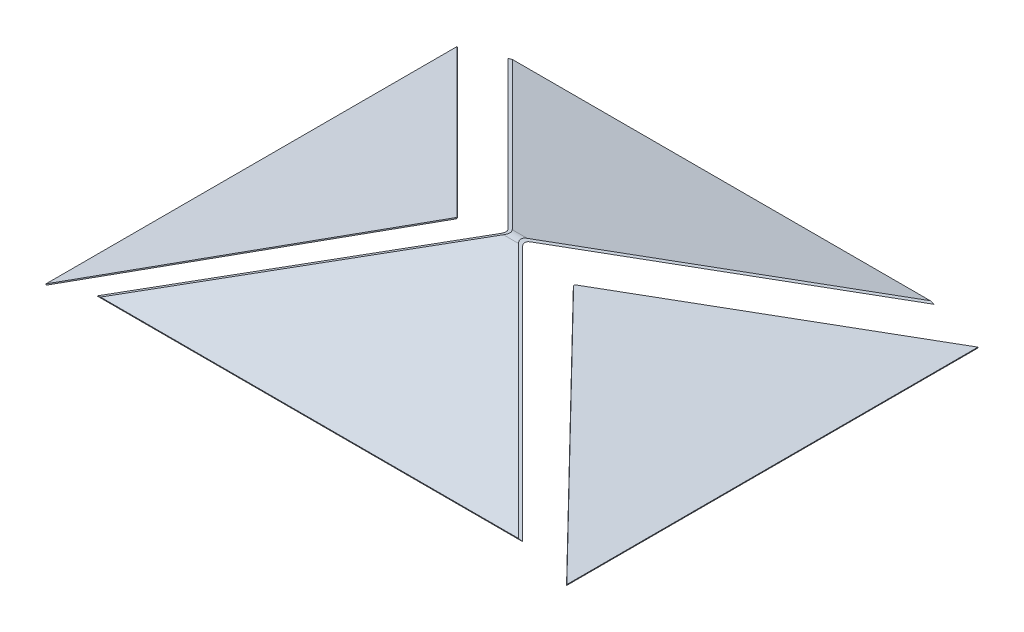
ISO-10303-21;
HEADER;
FILE_DESCRIPTION(('STEP AP214'),'2;1');
FILE_NAME('part.step','',(''),(''),'','','');
FILE_SCHEMA(('AUTOMOTIVE_DESIGN { 1 0 10303 214 1 1 1 1 }'));
ENDSEC;
DATA;
#1=APPLICATION_CONTEXT('core data for automotive mechanical design processes');
#2=APPLICATION_PROTOCOL_DEFINITION('international standard','automotive_design',2000,#1);
#3=PRODUCT_CONTEXT('',#1,'mechanical');
#4=PRODUCT('Part','Part','',(#3));
#5=PRODUCT_RELATED_PRODUCT_CATEGORY('part','',(#4));
#6=PRODUCT_DEFINITION_FORMATION('','',#4);
#7=PRODUCT_DEFINITION_CONTEXT('part definition',#1,'design');
#8=PRODUCT_DEFINITION('design','',#6,#7);
#9=PRODUCT_DEFINITION_SHAPE('','',#8);
#10=(LENGTH_UNIT() NAMED_UNIT(*) SI_UNIT(.MILLI.,.METRE.));
#11=(NAMED_UNIT(*) PLANE_ANGLE_UNIT() SI_UNIT($,.RADIAN.));
#12=(NAMED_UNIT(*) SI_UNIT($,.STERADIAN.) SOLID_ANGLE_UNIT());
#13=UNCERTAINTY_MEASURE_WITH_UNIT(LENGTH_MEASURE(1.E-05),#10,'distance_accuracy_value','');
#14=(GEOMETRIC_REPRESENTATION_CONTEXT(3) GLOBAL_UNCERTAINTY_ASSIGNED_CONTEXT((#13)) GLOBAL_UNIT_ASSIGNED_CONTEXT((#10,
#11,#12)) REPRESENTATION_CONTEXT('',''));
#15=CARTESIAN_POINT('',(0.,0.,0.));
#16=DIRECTION('',(0.,0.,1.));
#17=DIRECTION('',(1.,0.,0.));
#18=AXIS2_PLACEMENT_3D('',#15,#16,#17);
#19=CARTESIAN_POINT('',(134.970796635367,-14.5632168798622,0.));
#20=DIRECTION('',(-0.258819045102521,0.965925826289068,0.));
#21=DIRECTION('',(0.,0.,1.));
#22=AXIS2_PLACEMENT_3D('',#19,#20,#21);
#23=ELLIPSE('',#22,10.,9.99999999999998);
#24=DIRECTION('',(0.258819045102521,-0.965925826289068,0.));
#25=VECTOR('',#24,1.);
#26=SURFACE_OF_LINEAR_EXTRUSION('',#23,#25);
#27=CARTESIAN_POINT('',(135.229615680469,-15.5291427061513,0.));
#28=DIRECTION('',(-0.258819045102521,0.965925826289068,0.));
#29=DIRECTION('',(0.,0.,1.));
#30=AXIS2_PLACEMENT_3D('',#27,#28,#29);
#31=ELLIPSE('',#30,10.,9.99999999999998);
#32=CARTESIAN_POINT('',(144.865729430412,-12.9471538086797,0.691841839943579));
#33=VERTEX_POINT('',#32);
#34=CARTESIAN_POINT('',(144.865729430412,-12.9471538086797,-0.691841839943693));
#35=VERTEX_POINT('',#34);
#36=EDGE_CURVE('E109',#33,#35,#31,.T.);
#37=ORIENTED_EDGE('',*,*,#36,.T.);
#38=DIRECTION('',(0.258819045102521,-0.965925826289068,0.));
#39=VECTOR('',#38,1.);
#40=CARTESIAN_POINT('',(144.60691038531,-11.9812279823906,-0.691841839943693));
#41=LINE('',#40,#39);
#42=CARTESIAN_POINT('',(144.60691038531,-11.9812279823906,-0.691841839943693));
#43=VERTEX_POINT('',#42);
#44=EDGE_CURVE('E12',#43,#35,#41,.T.);
#45=ORIENTED_EDGE('',*,*,#44,.F.);
#46=CARTESIAN_POINT('',(144.60691038531,-11.9812279823906,0.691841839943579));
#47=VERTEX_POINT('',#46);
#48=EDGE_CURVE('E98',#47,#43,#23,.T.);
#49=ORIENTED_EDGE('',*,*,#48,.F.);
#50=DIRECTION('',(0.258819045102521,-0.965925826289068,0.));
#51=VECTOR('',#50,1.);
#52=CARTESIAN_POINT('',(144.60691038531,-11.9812279823906,0.691841839943579));
#53=LINE('',#52,#51);
#54=EDGE_CURVE('E106',#47,#33,#53,.T.);
#55=ORIENTED_EDGE('',*,*,#54,.T.);
#56=EDGE_LOOP('',(#37,#45,#49,#55));
#57=FACE_BOUND('',#56,.T.);
#58=ADVANCED_FACE('F46',(#57),#26,.F.);
#59=CARTESIAN_POINT('',(144.60691038531,-11.9812279823906,-0.691841839943693));
#60=DIRECTION('',(-0.671073674593449,-0.179813649169101,0.719254596676404));
#61=DIRECTION('',(0.731172197475327,0.,0.682192947514925));
#62=AXIS2_PLACEMENT_3D('',#59,#60,#61);
#63=PLANE('',#62);
#64=DIRECTION('',(-0.694746590606866,-0.186156787897386,-0.694746590606865));
#65=VECTOR('',#64,1.);
#66=CARTESIAN_POINT('',(144.865729430412,-12.9471538086797,-0.691841839943693));
#67=LINE('',#66,#65);
#68=CARTESIAN_POINT('',(-44.4371501508638,-63.6707075173686,-189.994721421219));
#69=VERTEX_POINT('',#68);
#70=EDGE_CURVE('E102',#35,#69,#67,.T.);
#71=ORIENTED_EDGE('',*,*,#70,.T.);
#72=DIRECTION('',(0.258819045102521,-0.965925826289068,0.));
#73=VECTOR('',#72,1.);
#74=CARTESIAN_POINT('',(-44.6959691959663,-62.7047816910796,-189.994721421219));
#75=LINE('',#74,#73);
#76=CARTESIAN_POINT('',(-44.6959691959663,-62.7047816910796,-189.994721421219));
#77=VERTEX_POINT('',#76);
#78=EDGE_CURVE('E55',#77,#69,#75,.T.);
#79=ORIENTED_EDGE('',*,*,#78,.F.);
#80=DIRECTION('',(-0.694746590606866,-0.186156787897386,-0.694746590606865));
#81=VECTOR('',#80,1.);
#82=CARTESIAN_POINT('',(144.60691038531,-11.9812279823906,-0.691841839943693));
#83=LINE('',#82,#81);
#84=EDGE_CURVE('E93',#43,#77,#83,.T.);
#85=ORIENTED_EDGE('',*,*,#84,.F.);
#86=ORIENTED_EDGE('',*,*,#44,.T.);
#87=EDGE_LOOP('',(#71,#79,#85,#86));
#88=FACE_BOUND('',#87,.T.);
#89=ADVANCED_FACE('F101',(#88),#63,.F.);
#90=CARTESIAN_POINT('',(-44.6959691959663,-62.7047816910796,-189.994721421219));
#91=DIRECTION('',(0.965925826289068,0.258819045102521,0.));
#92=DIRECTION('',(-0.258819045102521,0.965925826289068,0.));
#93=AXIS2_PLACEMENT_3D('',#90,#91,#92);
#94=PLANE('',#93);
#95=DIRECTION('',(0.,0.,1.));
#96=VECTOR('',#95,1.);
#97=CARTESIAN_POINT('',(-44.4371501508638,-63.6707075173686,-189.994721421219));
#98=LINE('',#97,#96);
#99=CARTESIAN_POINT('',(-44.4371501508638,-63.6707075173686,196.375609094408));
#100=VERTEX_POINT('',#99);
#101=EDGE_CURVE('E80',#69,#100,#98,.T.);
#102=ORIENTED_EDGE('',*,*,#101,.T.);
#103=DIRECTION('',(0.258819045102521,-0.965925826289068,0.));
#104=VECTOR('',#103,1.);
#105=CARTESIAN_POINT('',(-44.6959691959663,-62.7047816910796,196.375609094408));
#106=LINE('',#105,#104);
#107=CARTESIAN_POINT('',(-44.6959691959663,-62.7047816910796,196.375609094408));
#108=VERTEX_POINT('',#107);
#109=EDGE_CURVE('E103',#108,#100,#106,.T.);
#110=ORIENTED_EDGE('',*,*,#109,.F.);
#111=DIRECTION('',(0.,0.,1.));
#112=VECTOR('',#111,1.);
#113=CARTESIAN_POINT('',(-44.6959691959663,-62.7047816910796,-189.994721421219));
#114=LINE('',#113,#112);
#115=EDGE_CURVE('E96',#77,#108,#114,.T.);
#116=ORIENTED_EDGE('',*,*,#115,.F.);
#117=ORIENTED_EDGE('',*,*,#78,.T.);
#118=EDGE_LOOP('',(#102,#110,#116,#117));
#119=FACE_BOUND('',#118,.T.);
#120=ADVANCED_FACE('F104',(#119),#94,.F.);
#121=CARTESIAN_POINT('',(-44.6959691959663,-62.7047816910796,196.375609094408));
#122=DIRECTION('',(-0.68249458473455,-0.182873872818237,-0.707642768950884));
#123=DIRECTION('',(-0.71978087835063,0.,0.694201330422808));
#124=AXIS2_PLACEMENT_3D('',#121,#122,#123);
#125=PLANE('',#124);
#126=DIRECTION('',(0.683530426316366,0.183151425733571,-0.706570386834551));
#127=VECTOR('',#126,1.);
#128=CARTESIAN_POINT('',(-44.4371501508638,-63.6707075173686,196.375609094408));
#129=LINE('',#128,#127);
#130=EDGE_CURVE('E86',#100,#33,#129,.T.);
#131=ORIENTED_EDGE('',*,*,#130,.T.);
#132=ORIENTED_EDGE('',*,*,#54,.F.);
#133=DIRECTION('',(0.683530426316366,0.183151425733571,-0.706570386834551));
#134=VECTOR('',#133,1.);
#135=CARTESIAN_POINT('',(-44.6959691959663,-62.7047816910796,196.375609094408));
#136=LINE('',#135,#134);
#137=EDGE_CURVE('E63',#108,#47,#136,.T.);
#138=ORIENTED_EDGE('',*,*,#137,.F.);
#139=ORIENTED_EDGE('',*,*,#109,.T.);
#140=EDGE_LOOP('',(#131,#132,#138,#139));
#141=FACE_BOUND('',#140,.T.);
#142=ADVANCED_FACE('F116',(#141),#125,.F.);
#143=CARTESIAN_POINT('',(134.970796635367,-14.5632168798622,0.));
#144=DIRECTION('',(-0.258819045102521,0.965925826289068,0.));
#145=DIRECTION('',(-0.965925826289068,-0.258819045102521,0.));
#146=AXIS2_PLACEMENT_3D('',#143,#144,#145);
#147=PLANE('',#146);
#148=ORIENTED_EDGE('',*,*,#48,.T.);
#149=ORIENTED_EDGE('',*,*,#84,.T.);
#150=ORIENTED_EDGE('',*,*,#115,.T.);
#151=ORIENTED_EDGE('',*,*,#137,.T.);
#152=EDGE_LOOP('',(#148,#149,#150,#151));
#153=FACE_BOUND('',#152,.T.);
#154=ADVANCED_FACE('F94',(#153),#147,.T.);
#155=CARTESIAN_POINT('',(135.229615680469,-15.5291427061513,0.));
#156=DIRECTION('',(-0.258819045102521,0.965925826289068,0.));
#157=DIRECTION('',(-0.965925826289068,-0.258819045102521,0.));
#158=AXIS2_PLACEMENT_3D('',#155,#156,#157);
#159=PLANE('',#158);
#160=ORIENTED_EDGE('',*,*,#36,.F.);
#161=ORIENTED_EDGE('',*,*,#130,.F.);
#162=ORIENTED_EDGE('',*,*,#101,.F.);
#163=ORIENTED_EDGE('',*,*,#70,.F.);
#164=EDGE_LOOP('',(#160,#161,#162,#163));
#165=FACE_BOUND('',#164,.T.);
#166=ADVANCED_FACE('F119',(#165),#159,.F.);
#167=CLOSED_SHELL('',(#58,#89,#120,#142,#154,#166));
#168=MANIFOLD_SOLID_BREP('B2',#167);
#169=CARTESIAN_POINT('',(255.39308961469,-11.9812279823906,0.691841839943619));
#170=DIRECTION('',(0.68249458473455,-0.182873872818237,-0.707642768950883));
#171=DIRECTION('',(-0.719780878350629,0.,-0.694201330422808));
#172=AXIS2_PLACEMENT_3D('',#169,#170,#171);
#173=PLANE('',#172);
#174=DIRECTION('',(0.683530426316366,-0.183151425733571,0.706570386834551));
#175=VECTOR('',#174,1.);
#176=CARTESIAN_POINT('',(255.134270569588,-12.9471538086797,0.691841839943619));
#177=LINE('',#176,#175);
#178=CARTESIAN_POINT('',(255.134270569588,-12.9471538086797,0.691841839943615));
#179=VERTEX_POINT('',#178);
#180=CARTESIAN_POINT('',(444.437150150864,-63.6707075173686,196.375609094408));
#181=VERTEX_POINT('',#180);
#182=EDGE_CURVE('E244',#179,#181,#177,.T.);
#183=ORIENTED_EDGE('',*,*,#182,.T.);
#184=DIRECTION('',(-0.258819045102521,-0.965925826289068,0.));
#185=VECTOR('',#184,1.);
#186=CARTESIAN_POINT('',(444.695969195966,-62.7047816910795,196.375609094408));
#187=LINE('',#186,#185);
#188=CARTESIAN_POINT('',(444.695969195966,-62.7047816910795,196.375609094408));
#189=VERTEX_POINT('',#188);
#190=EDGE_CURVE('E44',#189,#181,#187,.T.);
#191=ORIENTED_EDGE('',*,*,#190,.F.);
#192=DIRECTION('',(0.683530426316366,-0.183151425733571,0.706570386834551));
#193=VECTOR('',#192,1.);
#194=CARTESIAN_POINT('',(255.39308961469,-11.9812279823906,0.691841839943619));
#195=LINE('',#194,#193);
#196=CARTESIAN_POINT('',(255.39308961469,-11.9812279823906,0.691841839943615));
#197=VERTEX_POINT('',#196);
#198=EDGE_CURVE('E231',#197,#189,#195,.T.);
#199=ORIENTED_EDGE('',*,*,#198,.F.);
#200=DIRECTION('',(-0.258819045102521,-0.965925826289068,0.));
#201=VECTOR('',#200,1.);
#202=CARTESIAN_POINT('',(255.39308961469,-11.9812279823906,0.691841839943615));
#203=LINE('',#202,#201);
#204=EDGE_CURVE('E239',#197,#179,#203,.T.);
#205=ORIENTED_EDGE('',*,*,#204,.T.);
#206=EDGE_LOOP('',(#183,#191,#199,#205));
#207=FACE_BOUND('',#206,.T.);
#208=ADVANCED_FACE('F180',(#207),#173,.F.);
#209=CARTESIAN_POINT('',(444.695969195966,-62.7047816910795,196.375609094408));
#210=DIRECTION('',(-0.965925826289068,0.258819045102521,0.));
#211=DIRECTION('',(-0.258819045102521,-0.965925826289068,0.));
#212=AXIS2_PLACEMENT_3D('',#209,#210,#211);
#213=PLANE('',#212);
#214=DIRECTION('',(0.,0.,-1.));
#215=VECTOR('',#214,1.);
#216=CARTESIAN_POINT('',(444.437150150864,-63.6707075173686,196.375609094408));
#217=LINE('',#216,#215);
#218=CARTESIAN_POINT('',(444.437150150864,-63.6707075173686,-189.994721421219));
#219=VERTEX_POINT('',#218);
#220=EDGE_CURVE('E235',#181,#219,#217,.T.);
#221=ORIENTED_EDGE('',*,*,#220,.T.);
#222=DIRECTION('',(-0.258819045102521,-0.965925826289068,0.));
#223=VECTOR('',#222,1.);
#224=CARTESIAN_POINT('',(444.695969195966,-62.7047816910795,-189.994721421219));
#225=LINE('',#224,#223);
#226=CARTESIAN_POINT('',(444.695969195966,-62.7047816910795,-189.994721421219));
#227=VERTEX_POINT('',#226);
#228=EDGE_CURVE('E188',#227,#219,#225,.T.);
#229=ORIENTED_EDGE('',*,*,#228,.F.);
#230=DIRECTION('',(0.,0.,-1.));
#231=VECTOR('',#230,1.);
#232=CARTESIAN_POINT('',(444.695969195966,-62.7047816910795,196.375609094408));
#233=LINE('',#232,#231);
#234=EDGE_CURVE('E226',#189,#227,#233,.T.);
#235=ORIENTED_EDGE('',*,*,#234,.F.);
#236=ORIENTED_EDGE('',*,*,#190,.T.);
#237=EDGE_LOOP('',(#221,#229,#235,#236));
#238=FACE_BOUND('',#237,.T.);
#239=ADVANCED_FACE('F234',(#238),#213,.F.);
#240=CARTESIAN_POINT('',(444.695969195966,-62.7047816910795,-189.994721421219));
#241=DIRECTION('',(0.671073674593449,-0.179813649169101,0.719254596676404));
#242=DIRECTION('',(0.731172197475327,0.,-0.682192947514925));
#243=AXIS2_PLACEMENT_3D('',#240,#241,#242);
#244=PLANE('',#243);
#245=DIRECTION('',(-0.694746590606866,0.186156787897385,0.694746590606865));
#246=VECTOR('',#245,1.);
#247=CARTESIAN_POINT('',(444.437150150864,-63.6707075173686,-189.994721421219));
#248=LINE('',#247,#246);
#249=CARTESIAN_POINT('',(255.134270569588,-12.9471538086797,-0.691841839943661));
#250=VERTEX_POINT('',#249);
#251=EDGE_CURVE('E213',#219,#250,#248,.T.);
#252=ORIENTED_EDGE('',*,*,#251,.T.);
#253=DIRECTION('',(-0.258819045102521,-0.965925826289068,0.));
#254=VECTOR('',#253,1.);
#255=CARTESIAN_POINT('',(255.39308961469,-11.9812279823906,-0.691841839943661));
#256=LINE('',#255,#254);
#257=CARTESIAN_POINT('',(255.39308961469,-11.9812279823906,-0.691841839943661));
#258=VERTEX_POINT('',#257);
#259=EDGE_CURVE('E236',#258,#250,#256,.T.);
#260=ORIENTED_EDGE('',*,*,#259,.F.);
#261=DIRECTION('',(-0.694746590606866,0.186156787897385,0.694746590606865));
#262=VECTOR('',#261,1.);
#263=CARTESIAN_POINT('',(444.695969195966,-62.7047816910795,-189.994721421219));
#264=LINE('',#263,#262);
#265=EDGE_CURVE('E229',#227,#258,#264,.T.);
#266=ORIENTED_EDGE('',*,*,#265,.F.);
#267=ORIENTED_EDGE('',*,*,#228,.T.);
#268=EDGE_LOOP('',(#252,#260,#266,#267));
#269=FACE_BOUND('',#268,.T.);
#270=ADVANCED_FACE('F237',(#269),#244,.F.);
#271=CARTESIAN_POINT('',(265.029203364633,-14.5632168798622,0.));
#272=DIRECTION('',(0.258819045102521,0.965925826289068,0.));
#273=DIRECTION('',(0.965925826289068,-0.258819045102521,0.));
#274=AXIS2_PLACEMENT_3D('',#271,#272,#273);
#275=ELLIPSE('',#274,10.,10.);
#276=DIRECTION('',(-0.258819045102521,-0.965925826289068,0.));
#277=VECTOR('',#276,1.);
#278=SURFACE_OF_LINEAR_EXTRUSION('',#275,#277);
#279=CARTESIAN_POINT('',(264.770384319531,-15.5291427061513,0.));
#280=DIRECTION('',(0.258819045102521,0.965925826289068,0.));
#281=DIRECTION('',(0.965925826289068,-0.258819045102521,0.));
#282=AXIS2_PLACEMENT_3D('',#279,#280,#281);
#283=ELLIPSE('',#282,10.,10.);
#284=EDGE_CURVE('E219',#250,#179,#283,.T.);
#285=ORIENTED_EDGE('',*,*,#284,.T.);
#286=ORIENTED_EDGE('',*,*,#204,.F.);
#287=EDGE_CURVE('E196',#258,#197,#275,.T.);
#288=ORIENTED_EDGE('',*,*,#287,.F.);
#289=ORIENTED_EDGE('',*,*,#259,.T.);
#290=EDGE_LOOP('',(#285,#286,#288,#289));
#291=FACE_BOUND('',#290,.T.);
#292=ADVANCED_FACE('F247',(#291),#278,.F.);
#293=CARTESIAN_POINT('',(265.029203364633,-14.5632168798622,0.));
#294=DIRECTION('',(0.258819045102521,0.965925826289068,0.));
#295=DIRECTION('',(-0.965925826289068,0.258819045102521,0.));
#296=AXIS2_PLACEMENT_3D('',#293,#294,#295);
#297=PLANE('',#296);
#298=ORIENTED_EDGE('',*,*,#198,.T.);
#299=ORIENTED_EDGE('',*,*,#234,.T.);
#300=ORIENTED_EDGE('',*,*,#265,.T.);
#301=ORIENTED_EDGE('',*,*,#287,.T.);
#302=EDGE_LOOP('',(#298,#299,#300,#301));
#303=FACE_BOUND('',#302,.T.);
#304=ADVANCED_FACE('F227',(#303),#297,.T.);
#305=CARTESIAN_POINT('',(264.770384319531,-15.5291427061513,0.));
#306=DIRECTION('',(0.258819045102521,0.965925826289068,0.));
#307=DIRECTION('',(-0.965925826289068,0.258819045102521,0.));
#308=AXIS2_PLACEMENT_3D('',#305,#306,#307);
#309=PLANE('',#308);
#310=ORIENTED_EDGE('',*,*,#182,.F.);
#311=ORIENTED_EDGE('',*,*,#284,.F.);
#312=ORIENTED_EDGE('',*,*,#251,.F.);
#313=ORIENTED_EDGE('',*,*,#220,.F.);
#314=EDGE_LOOP('',(#310,#311,#312,#313));
#315=FACE_BOUND('',#314,.T.);
#316=ADVANCED_FACE('F251',(#315),#309,.F.);
#317=CLOSED_SHELL('',(#208,#239,#270,#292,#304,#316));
#318=MANIFOLD_SOLID_BREP('B6',#317);
#319=CARTESIAN_POINT('',(400.,-50.7978831942273,193.443984302913));
#320=DIRECTION('',(0.,0.258819045102555,-0.965925826289059));
#321=DIRECTION('',(0.,0.965925826289059,0.258819045102555));
#322=AXIS2_PLACEMENT_3D('',#319,#320,#321);
#323=PLANE('',#322);
#324=DIRECTION('',(-1.,0.,0.));
#325=VECTOR('',#324,1.);
#326=CARTESIAN_POINT('',(400.,-51.7638090205041,193.185165257814));
#327=LINE('',#326,#325);
#328=CARTESIAN_POINT('',(400.,-51.7638090205041,193.185165257813));
#329=VERTEX_POINT('',#328);
#330=CARTESIAN_POINT('',(0.,-51.7638090205041,193.185165257814));
#331=VERTEX_POINT('',#330);
#332=EDGE_CURVE('E178',#329,#331,#327,.T.);
#333=ORIENTED_EDGE('',*,*,#332,.F.);
#334=DIRECTION('',(-0.963611374994279,0.258198889747161,0.0691841839943741));
#335=VECTOR('',#334,1.);
#336=CARTESIAN_POINT('',(399.74241977966,-51.6947906084777,193.203658685579));
#337=LINE('',#336,#335);
#338=CARTESIAN_POINT('',(396.395115739993,-50.7978831942274,193.443984302913));
#339=VERTEX_POINT('',#338);
#340=EDGE_CURVE('E369',#329,#339,#337,.T.);
#341=ORIENTED_EDGE('',*,*,#340,.T.);
#342=DIRECTION('',(-1.,0.,0.));
#343=VECTOR('',#342,1.);
#344=CARTESIAN_POINT('',(400.,-50.7978831942273,193.443984302913));
#345=LINE('',#344,#343);
#346=CARTESIAN_POINT('',(3.60488426000938,-50.7978831942273,193.443984302913));
#347=VERTEX_POINT('',#346);
#348=EDGE_CURVE('E379',#339,#347,#345,.T.);
#349=ORIENTED_EDGE('',*,*,#348,.T.);
#350=DIRECTION('',(-0.96361137499428,-0.258198889747161,-0.0691841839943741));
#351=VECTOR('',#350,1.);
#352=CARTESIAN_POINT('',(371.676333027687,47.8265642600255,219.870325352249));
#353=LINE('',#352,#351);
#354=EDGE_CURVE('E327',#347,#331,#353,.T.);
#355=ORIENTED_EDGE('',*,*,#354,.T.);
#356=EDGE_LOOP('',(#333,#341,#349,#355));
#357=FACE_BOUND('',#356,.T.);
#358=ADVANCED_FACE('F305',(#357),#323,.F.);
#359=CARTESIAN_POINT('',(400.,-51.7638090205041,193.185165257814));
#360=DIRECTION('',(0.,0.965925826289068,0.258819045102521));
#361=DIRECTION('',(0.,-0.258819045102521,0.965925826289068));
#362=AXIS2_PLACEMENT_3D('',#359,#360,#361);
#363=PLANE('',#362);
#364=DIRECTION('',(-1.,0.,0.));
#365=VECTOR('',#364,1.);
#366=CARTESIAN_POINT('',(400.,-1.04025531181522,3.8822856765378));
#367=LINE('',#366,#365);
#368=CARTESIAN_POINT('',(210.697120418724,-1.04025531181522,3.8822856765378));
#369=VERTEX_POINT('',#368);
#370=CARTESIAN_POINT('',(189.302879581276,-1.04025531181522,3.8822856765378));
#371=VERTEX_POINT('',#370);
#372=EDGE_CURVE('E312',#369,#371,#367,.T.);
#373=ORIENTED_EDGE('',*,*,#372,.F.);
#374=DIRECTION('',(0.694746590606866,-0.186156787897385,0.694746590606866));
#375=VECTOR('',#374,1.);
#376=CARTESIAN_POINT('',(400.,-51.7638090205041,193.185165257814));
#377=LINE('',#376,#375);
#378=EDGE_CURVE('E380',#369,#329,#377,.T.);
#379=ORIENTED_EDGE('',*,*,#378,.T.);
#380=ORIENTED_EDGE('',*,*,#332,.T.);
#381=DIRECTION('',(0.694746590606866,0.186156787897385,-0.694746590606866));
#382=VECTOR('',#381,1.);
#383=CARTESIAN_POINT('',(193.069130063946,-0.0310915364905365,0.116035193868075));
#384=LINE('',#383,#382);
#385=EDGE_CURVE('E412',#331,#371,#384,.T.);
#386=ORIENTED_EDGE('',*,*,#385,.T.);
#387=EDGE_LOOP('',(#373,#379,#380,#386));
#388=FACE_BOUND('',#387,.T.);
#389=ADVANCED_FACE('F411',(#388),#363,.F.);
#390=CARTESIAN_POINT('',(400.,-15.5291427061513,0.));
#391=DIRECTION('',(-1.,0.,0.));
#392=DIRECTION('',(0.,0.,1.));
#393=AXIS2_PLACEMENT_3D('',#390,#391,#392);
#394=CYLINDRICAL_SURFACE('',#393,15.);
#395=DIRECTION('',(-1.,0.,0.));
#396=VECTOR('',#395,1.);
#397=CARTESIAN_POINT('',(400.,-1.04025531181523,-3.88228567653782));
#398=LINE('',#397,#396);
#399=CARTESIAN_POINT('',(210.697120418724,-1.04025531181523,-3.88228567653782));
#400=VERTEX_POINT('',#399);
#401=CARTESIAN_POINT('',(189.302879581276,-1.04025531181523,-3.88228567653784));
#402=VERTEX_POINT('',#401);
#403=EDGE_CURVE('E398',#400,#402,#398,.T.);
#404=ORIENTED_EDGE('',*,*,#403,.F.);
#405=CARTESIAN_POINT('',(264.770384319531,-15.5291427061513,0.));
#406=DIRECTION('',(-0.258819045102521,-0.965925826289068,0.));
#407=DIRECTION('',(-0.965925826289068,0.258819045102521,0.));
#408=AXIS2_PLACEMENT_3D('',#405,#406,#407);
#409=ELLIPSE('',#408,57.9555495773443,15.);
#410=EDGE_CURVE('E408',#400,#369,#409,.F.);
#411=ORIENTED_EDGE('',*,*,#410,.T.);
#412=ORIENTED_EDGE('',*,*,#372,.T.);
#413=CARTESIAN_POINT('',(135.229615680469,-15.5291427061513,0.));
#414=DIRECTION('',(0.258819045102521,-0.965925826289068,0.));
#415=DIRECTION('',(-0.965925826289068,-0.258819045102521,0.));
#416=AXIS2_PLACEMENT_3D('',#413,#414,#415);
#417=ELLIPSE('',#416,57.9555495773443,15.);
#418=EDGE_CURVE('E407',#371,#402,#417,.F.);
#419=ORIENTED_EDGE('',*,*,#418,.T.);
#420=EDGE_LOOP('',(#404,#411,#412,#419));
#421=FACE_BOUND('',#420,.T.);
#422=ADVANCED_FACE('F406',(#421),#394,.F.);
#423=CARTESIAN_POINT('',(400.,-1.04025531181523,-3.88228567653782));
#424=DIRECTION('',(0.,0.965925826289068,-0.258819045102521));
#425=DIRECTION('',(0.,0.258819045102521,0.965925826289068));
#426=AXIS2_PLACEMENT_3D('',#423,#424,#425);
#427=PLANE('',#426);
#428=DIRECTION('',(-1.,0.,0.));
#429=VECTOR('',#428,1.);
#430=CARTESIAN_POINT('',(400.,-51.7638090205041,-193.185165257814));
#431=LINE('',#430,#429);
#432=CARTESIAN_POINT('',(400.,-51.7638090205041,-193.185165257814));
#433=VERTEX_POINT('',#432);
#434=CARTESIAN_POINT('',(0.,-51.7638090205041,-193.185165257814));
#435=VERTEX_POINT('',#434);
#436=EDGE_CURVE('E395',#433,#435,#431,.T.);
#437=ORIENTED_EDGE('',*,*,#436,.F.);
#438=DIRECTION('',(-0.694746590606866,0.186156787897385,0.694746590606866));
#439=VECTOR('',#438,1.);
#440=CARTESIAN_POINT('',(302.068476117116,-25.5231362825362,-95.2536413749297));
#441=LINE('',#440,#439);
#442=EDGE_CURVE('E426',#433,#400,#441,.T.);
#443=ORIENTED_EDGE('',*,*,#442,.T.);
#444=ORIENTED_EDGE('',*,*,#403,.T.);
#445=DIRECTION('',(-0.694746590606866,-0.186156787897385,-0.694746590606866));
#446=VECTOR('',#445,1.);
#447=CARTESIAN_POINT('',(291.00065394683,26.2095812014774,97.8154886890158));
#448=LINE('',#447,#446);
#449=EDGE_CURVE('E415',#402,#435,#448,.T.);
#450=ORIENTED_EDGE('',*,*,#449,.T.);
#451=EDGE_LOOP('',(#437,#443,#444,#450));
#452=FACE_BOUND('',#451,.T.);
#453=ADVANCED_FACE('F431',(#452),#427,.F.);
#454=CARTESIAN_POINT('',(400.,-51.7638090205041,-193.185165257814));
#455=DIRECTION('',(0.,0.258819045102521,0.965925826289068));
#456=DIRECTION('',(0.,-0.965925826289068,0.258819045102521));
#457=AXIS2_PLACEMENT_3D('',#454,#455,#456);
#458=PLANE('',#457);
#459=DIRECTION('',(-1.,0.,0.));
#460=VECTOR('',#459,1.);
#461=CARTESIAN_POINT('',(400.,-50.7978831942028,-193.443984302919));
#462=LINE('',#461,#460);
#463=CARTESIAN_POINT('',(396.3951157399,-50.7978831942028,-193.443984302919));
#464=VERTEX_POINT('',#463);
#465=CARTESIAN_POINT('',(3.6048842600998,-50.7978831942028,-193.443984302919));
#466=VERTEX_POINT('',#465);
#467=EDGE_CURVE('E392',#464,#466,#462,.T.);
#468=ORIENTED_EDGE('',*,*,#467,.F.);
#469=DIRECTION('',(0.96361137499428,-0.258198889747161,0.0691841839943643));
#470=VECTOR('',#469,1.);
#471=CARTESIAN_POINT('',(400.,-51.7638090205041,-193.185165257814));
#472=LINE('',#471,#470);
#473=EDGE_CURVE('E423',#464,#433,#472,.T.);
#474=ORIENTED_EDGE('',*,*,#473,.T.);
#475=ORIENTED_EDGE('',*,*,#436,.T.);
#476=DIRECTION('',(0.96361137499428,0.258198889747161,-0.0691841839943643));
#477=VECTOR('',#476,1.);
#478=CARTESIAN_POINT('',(371.418752807347,47.7575458479992,-219.85183192448));
#479=LINE('',#478,#477);
#480=EDGE_CURVE('E437',#435,#466,#479,.T.);
#481=ORIENTED_EDGE('',*,*,#480,.T.);
#482=EDGE_LOOP('',(#468,#474,#475,#481));
#483=FACE_BOUND('',#482,.T.);
#484=ADVANCED_FACE('F435',(#483),#458,.F.);
#485=CARTESIAN_POINT('',(400.,-50.7978831942028,-193.443984302919));
#486=DIRECTION('',(0.,-0.965925826289089,0.258819045102443));
#487=DIRECTION('',(0.,-0.258819045102443,-0.965925826289089));
#488=AXIS2_PLACEMENT_3D('',#485,#486,#487);
#489=PLANE('',#488);
#490=DIRECTION('',(-1.,0.,0.));
#491=VECTOR('',#490,1.);
#492=CARTESIAN_POINT('',(400.,-0.0743294855297209,-4.14110472164212));
#493=LINE('',#492,#491);
#494=CARTESIAN_POINT('',(207.092236158684,-0.0743294855297203,-4.14110472164212));
#495=VERTEX_POINT('',#494);
#496=CARTESIAN_POINT('',(192.907763841316,-0.0743294855297203,-4.14110472164212));
#497=VERTEX_POINT('',#496);
#498=EDGE_CURVE('E386',#495,#497,#493,.T.);
#499=ORIENTED_EDGE('',*,*,#498,.F.);
#500=DIRECTION('',(0.694746590606758,-0.186156787897357,-0.694746590606981));
#501=VECTOR('',#500,1.);
#502=CARTESIAN_POINT('',(398.135095410097,-51.2641093416784,-195.183963973116));
#503=LINE('',#502,#501);
#504=EDGE_CURVE('E420',#495,#464,#503,.T.);
#505=ORIENTED_EDGE('',*,*,#504,.T.);
#506=ORIENTED_EDGE('',*,*,#467,.T.);
#507=DIRECTION('',(0.694746590606759,0.186156787897357,0.694746590606981));
#508=VECTOR('',#507,1.);
#509=CARTESIAN_POINT('',(194.934034653789,0.468608142319235,-2.11483390916825));
#510=LINE('',#509,#508);
#511=EDGE_CURVE('E442',#466,#497,#510,.T.);
#512=ORIENTED_EDGE('',*,*,#511,.T.);
#513=EDGE_LOOP('',(#499,#505,#506,#512));
#514=FACE_BOUND('',#513,.T.);
#515=ADVANCED_FACE('F441',(#514),#489,.F.);
#516=CARTESIAN_POINT('',(400.,-15.5291427061513,0.));
#517=DIRECTION('',(-1.,0.,0.));
#518=DIRECTION('',(0.,0.,1.));
#519=AXIS2_PLACEMENT_3D('',#516,#517,#518);
#520=CYLINDRICAL_SURFACE('',#519,15.9999999999971);
#521=DIRECTION('',(-1.,0.,0.));
#522=VECTOR('',#521,1.);
#523=CARTESIAN_POINT('',(400.,-0.0743294855272865,4.14110472163303));
#524=LINE('',#523,#522);
#525=CARTESIAN_POINT('',(207.092236158675,-0.0743294855272865,4.14110472163303));
#526=VERTEX_POINT('',#525);
#527=CARTESIAN_POINT('',(192.907763841325,-0.07432948552729,4.14110472163305));
#528=VERTEX_POINT('',#527);
#529=EDGE_CURVE('E384',#526,#528,#524,.T.);
#530=ORIENTED_EDGE('',*,*,#529,.F.);
#531=CARTESIAN_POINT('',(264.770384319531,-15.5291427061513,0.));
#532=DIRECTION('',(-0.258819045102521,-0.965925826289068,0.));
#533=DIRECTION('',(-0.965925826289068,0.258819045102521,0.));
#534=AXIS2_PLACEMENT_3D('',#531,#532,#533);
#535=ELLIPSE('',#534,61.819252882489,15.9999999999971);
#536=EDGE_CURVE('E319',#526,#495,#535,.T.);
#537=ORIENTED_EDGE('',*,*,#536,.T.);
#538=ORIENTED_EDGE('',*,*,#498,.T.);
#539=CARTESIAN_POINT('',(135.229615680469,-15.5291427061513,0.));
#540=DIRECTION('',(0.258819045102521,-0.965925826289068,0.));
#541=DIRECTION('',(-0.965925826289068,-0.258819045102521,0.));
#542=AXIS2_PLACEMENT_3D('',#539,#540,#541);
#543=ELLIPSE('',#542,61.819252882489,15.9999999999971);
#544=EDGE_CURVE('E446',#497,#528,#543,.T.);
#545=ORIENTED_EDGE('',*,*,#544,.T.);
#546=EDGE_LOOP('',(#530,#537,#538,#545));
#547=FACE_BOUND('',#546,.T.);
#548=ADVANCED_FACE('F444',(#547),#520,.T.);
#549=CARTESIAN_POINT('',(400.,-0.0743294855272856,4.14110472163303));
#550=DIRECTION('',(0.,-0.965925826289055,-0.258819045102568));
#551=DIRECTION('',(0.,0.258819045102568,-0.965925826289056));
#552=AXIS2_PLACEMENT_3D('',#549,#550,#551);
#553=PLANE('',#552);
#554=ORIENTED_EDGE('',*,*,#348,.F.);
#555=DIRECTION('',(-0.694746590606932,0.186156787897403,-0.694746590606795));
#556=VECTOR('',#555,1.);
#557=CARTESIAN_POINT('',(300.203571527257,-25.0234366037223,97.2524400901967));
#558=LINE('',#557,#556);
#559=EDGE_CURVE('E366',#339,#526,#558,.T.);
#560=ORIENTED_EDGE('',*,*,#559,.T.);
#561=ORIENTED_EDGE('',*,*,#529,.T.);
#562=DIRECTION('',(-0.694746590606932,-0.186156787897403,0.694746590606795));
#563=VECTOR('',#562,1.);
#564=CARTESIAN_POINT('',(292.865558536726,26.7092808803012,-95.8166899737475));
#565=LINE('',#564,#563);
#566=EDGE_CURVE('E383',#528,#347,#565,.T.);
#567=ORIENTED_EDGE('',*,*,#566,.T.);
#568=EDGE_LOOP('',(#554,#560,#561,#567));
#569=FACE_BOUND('',#568,.T.);
#570=ADVANCED_FACE('F382',(#569),#553,.F.);
#571=CARTESIAN_POINT('',(0.,-51.7638090205041,-193.443984302919));
#572=DIRECTION('',(0.258819045102521,-0.965925826289068,0.));
#573=DIRECTION('',(0.965925826289068,0.258819045102521,0.));
#574=AXIS2_PLACEMENT_3D('',#571,#572,#573);
#575=PLANE('',#574);
#576=ORIENTED_EDGE('',*,*,#566,.F.);
#577=ORIENTED_EDGE('',*,*,#544,.F.);
#578=ORIENTED_EDGE('',*,*,#511,.F.);
#579=ORIENTED_EDGE('',*,*,#480,.F.);
#580=ORIENTED_EDGE('',*,*,#449,.F.);
#581=ORIENTED_EDGE('',*,*,#418,.F.);
#582=ORIENTED_EDGE('',*,*,#385,.F.);
#583=ORIENTED_EDGE('',*,*,#354,.F.);
#584=EDGE_LOOP('',(#576,#577,#578,#579,#580,#581,#582,#583));
#585=FACE_BOUND('',#584,.T.);
#586=ADVANCED_FACE('F451',(#585),#575,.F.);
#587=CARTESIAN_POINT('',(203.882285676538,0.785774153905168,-193.443984302919));
#588=DIRECTION('',(-0.258819045102521,-0.965925826289068,0.));
#589=DIRECTION('',(0.965925826289068,-0.258819045102521,0.));
#590=AXIS2_PLACEMENT_3D('',#587,#588,#589);
#591=PLANE('',#590);
#592=ORIENTED_EDGE('',*,*,#378,.F.);
#593=ORIENTED_EDGE('',*,*,#410,.F.);
#594=ORIENTED_EDGE('',*,*,#442,.F.);
#595=ORIENTED_EDGE('',*,*,#473,.F.);
#596=ORIENTED_EDGE('',*,*,#504,.F.);
#597=ORIENTED_EDGE('',*,*,#536,.F.);
#598=ORIENTED_EDGE('',*,*,#559,.F.);
#599=ORIENTED_EDGE('',*,*,#340,.F.);
#600=EDGE_LOOP('',(#592,#593,#594,#595,#596,#597,#598,#599));
#601=FACE_BOUND('',#600,.T.);
#602=ADVANCED_FACE('F368',(#601),#591,.F.);
#603=CLOSED_SHELL('',(#358,#389,#422,#453,#484,#515,#548,#570,#586,#602));
#604=MANIFOLD_SOLID_BREP('B38',#603);
#605=ADVANCED_BREP_SHAPE_REPRESENTATION('',(#18,#168,#318,#604),#14);
#606=SHAPE_DEFINITION_REPRESENTATION(#9,#605);
ENDSEC;
END-ISO-10303-21;
